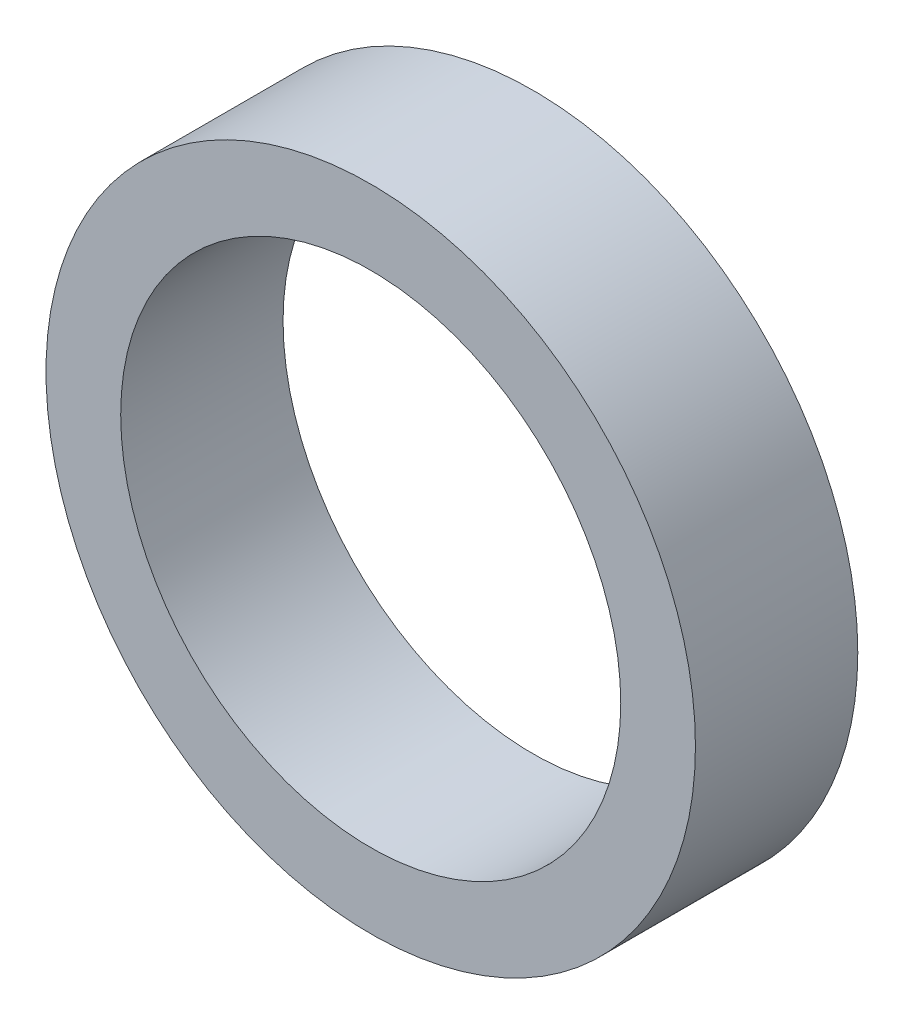
ISO-10303-21;
HEADER;
FILE_DESCRIPTION(('STEP AP214'),'2;1');
FILE_NAME('part.step','',(''),(''),'','','');
FILE_SCHEMA(('AUTOMOTIVE_DESIGN { 1 0 10303 214 1 1 1 1 }'));
ENDSEC;
DATA;
#1=APPLICATION_CONTEXT('core data for automotive mechanical design processes');
#2=APPLICATION_PROTOCOL_DEFINITION('international standard','automotive_design',2000,#1);
#3=PRODUCT_CONTEXT('',#1,'mechanical');
#4=PRODUCT('Part','Part','',(#3));
#5=PRODUCT_RELATED_PRODUCT_CATEGORY('part','',(#4));
#6=PRODUCT_DEFINITION_FORMATION('','',#4);
#7=PRODUCT_DEFINITION_CONTEXT('part definition',#1,'design');
#8=PRODUCT_DEFINITION('design','',#6,#7);
#9=PRODUCT_DEFINITION_SHAPE('','',#8);
#10=(LENGTH_UNIT() NAMED_UNIT(*) SI_UNIT(.MILLI.,.METRE.));
#11=(NAMED_UNIT(*) PLANE_ANGLE_UNIT() SI_UNIT($,.RADIAN.));
#12=(NAMED_UNIT(*) SI_UNIT($,.STERADIAN.) SOLID_ANGLE_UNIT());
#13=UNCERTAINTY_MEASURE_WITH_UNIT(LENGTH_MEASURE(1.E-05),#10,'distance_accuracy_value','');
#14=(GEOMETRIC_REPRESENTATION_CONTEXT(3) GLOBAL_UNCERTAINTY_ASSIGNED_CONTEXT((#13)) GLOBAL_UNIT_ASSIGNED_CONTEXT((#10,
#11,#12)) REPRESENTATION_CONTEXT('',''));
#15=CARTESIAN_POINT('',(0.,0.,0.));
#16=DIRECTION('',(0.,0.,1.));
#17=DIRECTION('',(1.,0.,0.));
#18=AXIS2_PLACEMENT_3D('',#15,#16,#17);
#19=CARTESIAN_POINT('',(0.,0.,5.));
#20=DIRECTION('',(0.,0.,1.));
#21=DIRECTION('',(1.,0.,0.));
#22=AXIS2_PLACEMENT_3D('',#19,#20,#21);
#23=PLANE('',#22);
#24=CARTESIAN_POINT('',(0.,0.,5.));
#25=DIRECTION('',(0.,0.,1.));
#26=DIRECTION('',(1.,0.,0.));
#27=AXIS2_PLACEMENT_3D('',#24,#25,#26);
#28=CIRCLE('',#27,10.);
#29=CARTESIAN_POINT('',(10.,0.,5.));
#30=VERTEX_POINT('',#29);
#31=EDGE_CURVE('E10',#30,#30,#28,.T.);
#32=ORIENTED_EDGE('',*,*,#31,.T.);
#33=EDGE_LOOP('',(#32));
#34=FACE_BOUND('',#33,.T.);
#35=CARTESIAN_POINT('',(0.,0.,5.));
#36=DIRECTION('',(0.,0.,1.));
#37=DIRECTION('',(1.,0.,0.));
#38=AXIS2_PLACEMENT_3D('',#35,#36,#37);
#39=CIRCLE('',#38,7.7);
#40=CARTESIAN_POINT('',(7.7,0.,5.));
#41=VERTEX_POINT('',#40);
#42=EDGE_CURVE('E48',#41,#41,#39,.T.);
#43=ORIENTED_EDGE('',*,*,#42,.F.);
#44=EDGE_LOOP('',(#43));
#45=FACE_BOUND('',#44,.T.);
#46=ADVANCED_FACE('F37',(#34,#45),#23,.T.);
#47=CARTESIAN_POINT('',(0.,0.,0.));
#48=DIRECTION('',(0.,0.,1.));
#49=DIRECTION('',(1.,0.,0.));
#50=AXIS2_PLACEMENT_3D('',#47,#48,#49);
#51=PLANE('',#50);
#52=CARTESIAN_POINT('',(0.,0.,0.));
#53=DIRECTION('',(0.,0.,1.));
#54=DIRECTION('',(1.,0.,0.));
#55=AXIS2_PLACEMENT_3D('',#52,#53,#54);
#56=CIRCLE('',#55,10.);
#57=CARTESIAN_POINT('',(10.,0.,0.));
#58=VERTEX_POINT('',#57);
#59=EDGE_CURVE('E41',#58,#58,#56,.T.);
#60=ORIENTED_EDGE('',*,*,#59,.F.);
#61=EDGE_LOOP('',(#60));
#62=FACE_BOUND('',#61,.T.);
#63=CARTESIAN_POINT('',(0.,0.,0.));
#64=DIRECTION('',(0.,0.,1.));
#65=DIRECTION('',(1.,0.,0.));
#66=AXIS2_PLACEMENT_3D('',#63,#64,#65);
#67=CIRCLE('',#66,7.7);
#68=CARTESIAN_POINT('',(7.7,0.,0.));
#69=VERTEX_POINT('',#68);
#70=EDGE_CURVE('E50',#69,#69,#67,.T.);
#71=ORIENTED_EDGE('',*,*,#70,.T.);
#72=EDGE_LOOP('',(#71));
#73=FACE_BOUND('',#72,.T.);
#74=ADVANCED_FACE('F60',(#62,#73),#51,.F.);
#75=CARTESIAN_POINT('',(0.,0.,5.));
#76=DIRECTION('',(0.,0.,-1.));
#77=DIRECTION('',(-1.,0.,0.));
#78=AXIS2_PLACEMENT_3D('',#75,#76,#77);
#79=CYLINDRICAL_SURFACE('',#78,10.);
#80=ORIENTED_EDGE('',*,*,#31,.F.);
#81=EDGE_LOOP('',(#80));
#82=FACE_BOUND('',#81,.T.);
#83=ORIENTED_EDGE('',*,*,#59,.T.);
#84=EDGE_LOOP('',(#83));
#85=FACE_BOUND('',#84,.T.);
#86=ADVANCED_FACE('F39',(#82,#85),#79,.T.);
#87=CARTESIAN_POINT('',(0.,0.,5.));
#88=DIRECTION('',(0.,0.,-1.));
#89=DIRECTION('',(-1.,0.,0.));
#90=AXIS2_PLACEMENT_3D('',#87,#88,#89);
#91=CYLINDRICAL_SURFACE('',#90,7.7);
#92=ORIENTED_EDGE('',*,*,#42,.T.);
#93=EDGE_LOOP('',(#92));
#94=FACE_BOUND('',#93,.T.);
#95=ORIENTED_EDGE('',*,*,#70,.F.);
#96=EDGE_LOOP('',(#95));
#97=FACE_BOUND('',#96,.T.);
#98=ADVANCED_FACE('F56',(#94,#97),#91,.F.);
#99=CLOSED_SHELL('',(#46,#74,#86,#98));
#100=MANIFOLD_SOLID_BREP('B2',#99);
#101=ADVANCED_BREP_SHAPE_REPRESENTATION('',(#18,#100),#14);
#102=SHAPE_DEFINITION_REPRESENTATION(#9,#101);
ENDSEC;
END-ISO-10303-21;
